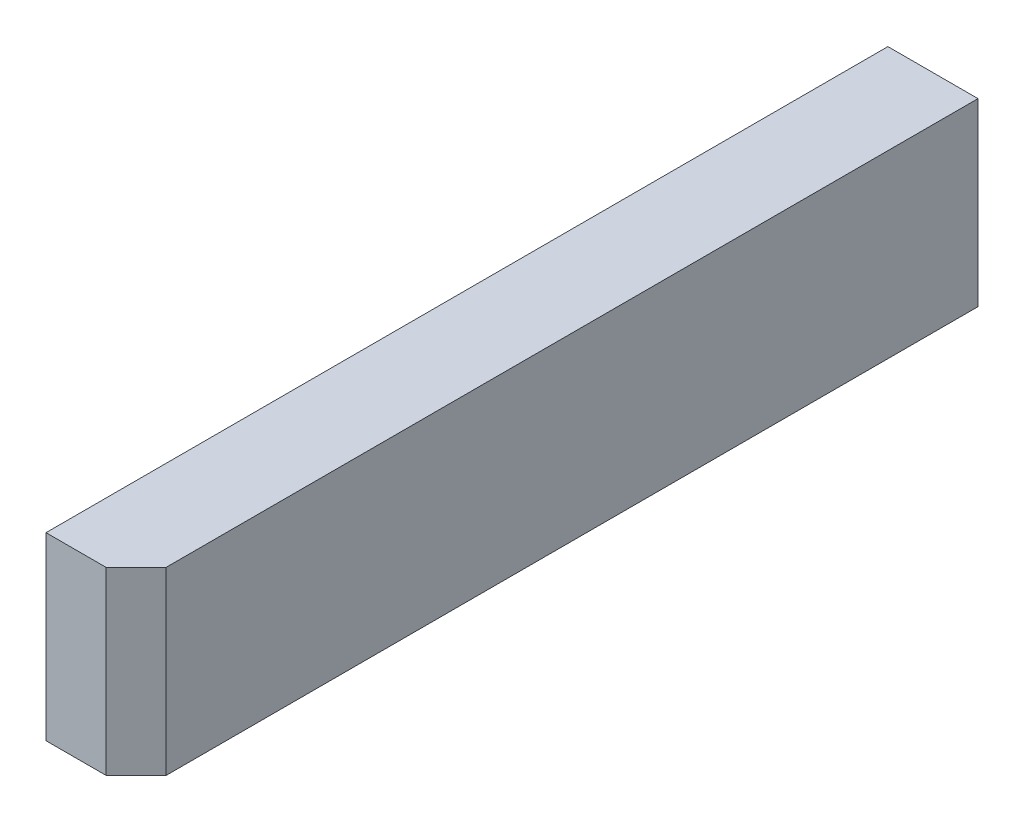
ISO-10303-21;
HEADER;
FILE_DESCRIPTION(('STEP AP214'),'2;1');
FILE_NAME('part.step','',(''),(''),'','','');
FILE_SCHEMA(('AUTOMOTIVE_DESIGN { 1 0 10303 214 1 1 1 1 }'));
ENDSEC;
DATA;
#1=APPLICATION_CONTEXT('core data for automotive mechanical design processes');
#2=APPLICATION_PROTOCOL_DEFINITION('international standard','automotive_design',2000,#1);
#3=PRODUCT_CONTEXT('',#1,'mechanical');
#4=PRODUCT('Part','Part','',(#3));
#5=PRODUCT_RELATED_PRODUCT_CATEGORY('part','',(#4));
#6=PRODUCT_DEFINITION_FORMATION('','',#4);
#7=PRODUCT_DEFINITION_CONTEXT('part definition',#1,'design');
#8=PRODUCT_DEFINITION('design','',#6,#7);
#9=PRODUCT_DEFINITION_SHAPE('','',#8);
#10=(LENGTH_UNIT() NAMED_UNIT(*) SI_UNIT(.MILLI.,.METRE.));
#11=(NAMED_UNIT(*) PLANE_ANGLE_UNIT() SI_UNIT($,.RADIAN.));
#12=(NAMED_UNIT(*) SI_UNIT($,.STERADIAN.) SOLID_ANGLE_UNIT());
#13=UNCERTAINTY_MEASURE_WITH_UNIT(LENGTH_MEASURE(1.E-05),#10,'distance_accuracy_value','');
#14=(GEOMETRIC_REPRESENTATION_CONTEXT(3) GLOBAL_UNCERTAINTY_ASSIGNED_CONTEXT((#13)) GLOBAL_UNIT_ASSIGNED_CONTEXT((#10,
#11,#12)) REPRESENTATION_CONTEXT('',''));
#15=CARTESIAN_POINT('',(0.,0.,0.));
#16=DIRECTION('',(0.,0.,1.));
#17=DIRECTION('',(1.,0.,0.));
#18=AXIS2_PLACEMENT_3D('',#15,#16,#17);
#19=CARTESIAN_POINT('',(19.05,-19.05,89.));
#20=DIRECTION('',(0.,0.,1.));
#21=DIRECTION('',(1.,0.,0.));
#22=AXIS2_PLACEMENT_3D('',#19,#20,#21);
#23=PLANE('',#22);
#24=DIRECTION('',(-1.,0.,0.));
#25=VECTOR('',#24,1.);
#26=CARTESIAN_POINT('',(19.05,-19.05,89.));
#27=LINE('',#26,#25);
#28=CARTESIAN_POINT('',(12.7,-19.05,89.));
#29=VERTEX_POINT('',#28);
#30=CARTESIAN_POINT('',(0.,-19.05,89.));
#31=VERTEX_POINT('',#30);
#32=EDGE_CURVE('E103',#29,#31,#27,.T.);
#33=ORIENTED_EDGE('',*,*,#32,.F.);
#34=DIRECTION('',(0.,1.,0.));
#35=VECTOR('',#34,1.);
#36=CARTESIAN_POINT('',(12.7,19.05,89.));
#37=LINE('',#36,#35);
#38=CARTESIAN_POINT('',(12.7,19.05,89.));
#39=VERTEX_POINT('',#38);
#40=EDGE_CURVE('E108',#29,#39,#37,.T.);
#41=ORIENTED_EDGE('',*,*,#40,.T.);
#42=DIRECTION('',(-1.,0.,0.));
#43=VECTOR('',#42,1.);
#44=CARTESIAN_POINT('',(19.05,19.05,89.));
#45=LINE('',#44,#43);
#46=CARTESIAN_POINT('',(0.,19.05,89.));
#47=VERTEX_POINT('',#46);
#48=EDGE_CURVE('E101',#39,#47,#45,.T.);
#49=ORIENTED_EDGE('',*,*,#48,.T.);
#50=DIRECTION('',(0.,1.,0.));
#51=VECTOR('',#50,1.);
#52=CARTESIAN_POINT('',(0.,-19.05,89.));
#53=LINE('',#52,#51);
#54=EDGE_CURVE('E121',#31,#47,#53,.T.);
#55=ORIENTED_EDGE('',*,*,#54,.F.);
#56=EDGE_LOOP('',(#33,#41,#49,#55));
#57=FACE_BOUND('',#56,.T.);
#58=ADVANCED_FACE('F36',(#57),#23,.T.);
#59=CARTESIAN_POINT('',(19.05,-19.05,89.));
#60=DIRECTION('',(0.,1.,0.));
#61=DIRECTION('',(0.,0.,1.));
#62=AXIS2_PLACEMENT_3D('',#59,#60,#61);
#63=PLANE('',#62);
#64=DIRECTION('',(0.,0.,-1.));
#65=VECTOR('',#64,1.);
#66=CARTESIAN_POINT('',(19.05,-19.05,89.));
#67=LINE('',#66,#65);
#68=CARTESIAN_POINT('',(19.05,-19.05,82.65));
#69=VERTEX_POINT('',#68);
#70=CARTESIAN_POINT('',(19.05,-19.05,-89.));
#71=VERTEX_POINT('',#70);
#72=EDGE_CURVE('E91',#69,#71,#67,.T.);
#73=ORIENTED_EDGE('',*,*,#72,.F.);
#74=DIRECTION('',(-0.707106781186547,0.,0.707106781186547));
#75=VECTOR('',#74,1.);
#76=CARTESIAN_POINT('',(12.7,-19.05,89.));
#77=LINE('',#76,#75);
#78=EDGE_CURVE('E11',#69,#29,#77,.T.);
#79=ORIENTED_EDGE('',*,*,#78,.T.);
#80=ORIENTED_EDGE('',*,*,#32,.T.);
#81=DIRECTION('',(0.,0.,-1.));
#82=VECTOR('',#81,1.);
#83=CARTESIAN_POINT('',(0.,-19.05,89.));
#84=LINE('',#83,#82);
#85=CARTESIAN_POINT('',(0.,-19.05,-89.));
#86=VERTEX_POINT('',#85);
#87=EDGE_CURVE('E87',#31,#86,#84,.T.);
#88=ORIENTED_EDGE('',*,*,#87,.T.);
#89=DIRECTION('',(-1.,0.,0.));
#90=VECTOR('',#89,1.);
#91=CARTESIAN_POINT('',(19.05,-19.05,-89.));
#92=LINE('',#91,#90);
#93=EDGE_CURVE('E100',#71,#86,#92,.T.);
#94=ORIENTED_EDGE('',*,*,#93,.F.);
#95=EDGE_LOOP('',(#73,#79,#80,#88,#94));
#96=FACE_BOUND('',#95,.T.);
#97=ADVANCED_FACE('F129',(#96),#63,.F.);
#98=CARTESIAN_POINT('',(19.05,-19.05,-89.));
#99=DIRECTION('',(0.,0.,1.));
#100=DIRECTION('',(1.,0.,0.));
#101=AXIS2_PLACEMENT_3D('',#98,#99,#100);
#102=PLANE('',#101);
#103=DIRECTION('',(0.,1.,0.));
#104=VECTOR('',#103,1.);
#105=CARTESIAN_POINT('',(0.,-19.05,-89.));
#106=LINE('',#105,#104);
#107=CARTESIAN_POINT('',(0.,19.05,-89.));
#108=VERTEX_POINT('',#107);
#109=EDGE_CURVE('E98',#86,#108,#106,.T.);
#110=ORIENTED_EDGE('',*,*,#109,.T.);
#111=DIRECTION('',(-1.,0.,0.));
#112=VECTOR('',#111,1.);
#113=CARTESIAN_POINT('',(19.05,19.05,-89.));
#114=LINE('',#113,#112);
#115=CARTESIAN_POINT('',(19.05,19.05,-89.));
#116=VERTEX_POINT('',#115);
#117=EDGE_CURVE('E84',#116,#108,#114,.T.);
#118=ORIENTED_EDGE('',*,*,#117,.F.);
#119=DIRECTION('',(0.,1.,0.));
#120=VECTOR('',#119,1.);
#121=CARTESIAN_POINT('',(19.05,-19.05,-89.));
#122=LINE('',#121,#120);
#123=EDGE_CURVE('E86',#71,#116,#122,.T.);
#124=ORIENTED_EDGE('',*,*,#123,.F.);
#125=ORIENTED_EDGE('',*,*,#93,.T.);
#126=EDGE_LOOP('',(#110,#118,#124,#125));
#127=FACE_BOUND('',#126,.T.);
#128=ADVANCED_FACE('F96',(#127),#102,.F.);
#129=CARTESIAN_POINT('',(19.05,19.05,89.));
#130=DIRECTION('',(0.,1.,0.));
#131=DIRECTION('',(0.,0.,1.));
#132=AXIS2_PLACEMENT_3D('',#129,#130,#131);
#133=PLANE('',#132);
#134=ORIENTED_EDGE('',*,*,#48,.F.);
#135=DIRECTION('',(0.707106781186547,0.,-0.707106781186547));
#136=VECTOR('',#135,1.);
#137=CARTESIAN_POINT('',(15.875,19.05,85.825));
#138=LINE('',#137,#136);
#139=CARTESIAN_POINT('',(19.05,19.05,82.65));
#140=VERTEX_POINT('',#139);
#141=EDGE_CURVE('E59',#39,#140,#138,.T.);
#142=ORIENTED_EDGE('',*,*,#141,.T.);
#143=DIRECTION('',(0.,0.,-1.));
#144=VECTOR('',#143,1.);
#145=CARTESIAN_POINT('',(19.05,19.05,89.));
#146=LINE('',#145,#144);
#147=EDGE_CURVE('E79',#140,#116,#146,.T.);
#148=ORIENTED_EDGE('',*,*,#147,.T.);
#149=ORIENTED_EDGE('',*,*,#117,.T.);
#150=DIRECTION('',(0.,0.,-1.));
#151=VECTOR('',#150,1.);
#152=CARTESIAN_POINT('',(0.,19.05,89.));
#153=LINE('',#152,#151);
#154=EDGE_CURVE('E119',#47,#108,#153,.T.);
#155=ORIENTED_EDGE('',*,*,#154,.F.);
#156=EDGE_LOOP('',(#134,#142,#148,#149,#155));
#157=FACE_BOUND('',#156,.T.);
#158=ADVANCED_FACE('F81',(#157),#133,.T.);
#159=CARTESIAN_POINT('',(19.05,0.,0.));
#160=DIRECTION('',(-1.,0.,0.));
#161=DIRECTION('',(0.,0.,1.));
#162=AXIS2_PLACEMENT_3D('',#159,#160,#161);
#163=PLANE('',#162);
#164=ORIENTED_EDGE('',*,*,#147,.F.);
#165=DIRECTION('',(0.,-1.,0.));
#166=VECTOR('',#165,1.);
#167=CARTESIAN_POINT('',(19.05,-19.05,82.65));
#168=LINE('',#167,#166);
#169=EDGE_CURVE('E45',#140,#69,#168,.T.);
#170=ORIENTED_EDGE('',*,*,#169,.T.);
#171=ORIENTED_EDGE('',*,*,#72,.T.);
#172=ORIENTED_EDGE('',*,*,#123,.T.);
#173=EDGE_LOOP('',(#164,#170,#171,#172));
#174=FACE_BOUND('',#173,.T.);
#175=ADVANCED_FACE('F90',(#174),#163,.F.);
#176=CARTESIAN_POINT('',(0.,0.,0.));
#177=DIRECTION('',(-1.,0.,0.));
#178=DIRECTION('',(0.,0.,1.));
#179=AXIS2_PLACEMENT_3D('',#176,#177,#178);
#180=PLANE('',#179);
#181=ORIENTED_EDGE('',*,*,#54,.T.);
#182=ORIENTED_EDGE('',*,*,#154,.T.);
#183=ORIENTED_EDGE('',*,*,#109,.F.);
#184=ORIENTED_EDGE('',*,*,#87,.F.);
#185=EDGE_LOOP('',(#181,#182,#183,#184));
#186=FACE_BOUND('',#185,.T.);
#187=ADVANCED_FACE('F126',(#186),#180,.T.);
#188=CARTESIAN_POINT('',(12.7,-19.05,89.));
#189=DIRECTION('',(0.707106781186547,0.,0.707106781186547));
#190=DIRECTION('',(0.,-1.,0.));
#191=AXIS2_PLACEMENT_3D('',#188,#189,#190);
#192=PLANE('',#191);
#193=ORIENTED_EDGE('',*,*,#78,.F.);
#194=ORIENTED_EDGE('',*,*,#169,.F.);
#195=ORIENTED_EDGE('',*,*,#141,.F.);
#196=ORIENTED_EDGE('',*,*,#40,.F.);
#197=EDGE_LOOP('',(#193,#194,#195,#196));
#198=FACE_BOUND('',#197,.T.);
#199=ADVANCED_FACE('F39',(#198),#192,.T.);
#200=CLOSED_SHELL('',(#58,#97,#128,#158,#175,#187,#199));
#201=MANIFOLD_SOLID_BREP('B2',#200);
#202=ADVANCED_BREP_SHAPE_REPRESENTATION('',(#18,#201),#14);
#203=SHAPE_DEFINITION_REPRESENTATION(#9,#202);
ENDSEC;
END-ISO-10303-21;
